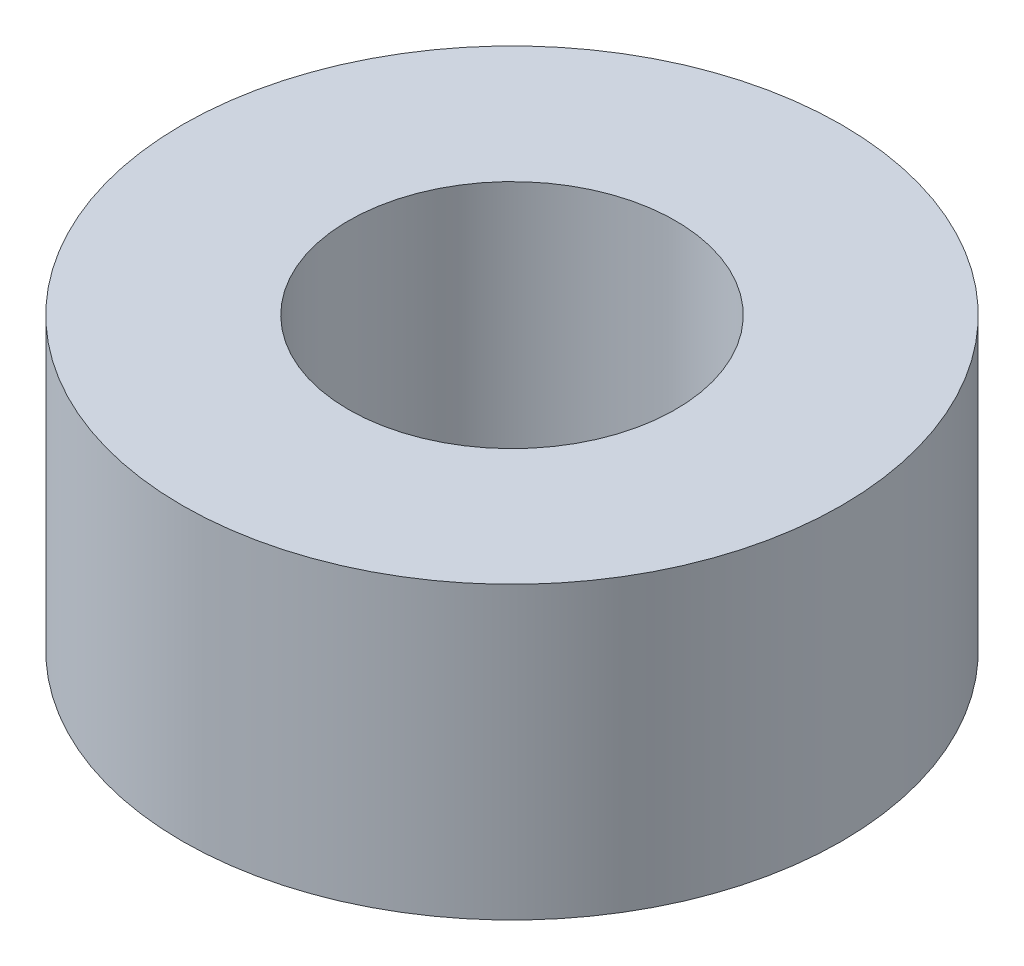
ISO-10303-21;
HEADER;
FILE_DESCRIPTION(('STEP AP214'),'2;1');
FILE_NAME('part.step','',(''),(''),'','','');
FILE_SCHEMA(('AUTOMOTIVE_DESIGN { 1 0 10303 214 1 1 1 1 }'));
ENDSEC;
DATA;
#1=APPLICATION_CONTEXT('core data for automotive mechanical design processes');
#2=APPLICATION_PROTOCOL_DEFINITION('international standard','automotive_design',2000,#1);
#3=PRODUCT_CONTEXT('',#1,'mechanical');
#4=PRODUCT('Part','Part','',(#3));
#5=PRODUCT_RELATED_PRODUCT_CATEGORY('part','',(#4));
#6=PRODUCT_DEFINITION_FORMATION('','',#4);
#7=PRODUCT_DEFINITION_CONTEXT('part definition',#1,'design');
#8=PRODUCT_DEFINITION('design','',#6,#7);
#9=PRODUCT_DEFINITION_SHAPE('','',#8);
#10=(LENGTH_UNIT() NAMED_UNIT(*) SI_UNIT(.MILLI.,.METRE.));
#11=(NAMED_UNIT(*) PLANE_ANGLE_UNIT() SI_UNIT($,.RADIAN.));
#12=(NAMED_UNIT(*) SI_UNIT($,.STERADIAN.) SOLID_ANGLE_UNIT());
#13=UNCERTAINTY_MEASURE_WITH_UNIT(LENGTH_MEASURE(1.E-05),#10,'distance_accuracy_value','');
#14=(GEOMETRIC_REPRESENTATION_CONTEXT(3) GLOBAL_UNCERTAINTY_ASSIGNED_CONTEXT((#13)) GLOBAL_UNIT_ASSIGNED_CONTEXT((#10,
#11,#12)) REPRESENTATION_CONTEXT('',''));
#15=CARTESIAN_POINT('',(0.,0.,0.));
#16=DIRECTION('',(0.,0.,1.));
#17=DIRECTION('',(1.,0.,0.));
#18=AXIS2_PLACEMENT_3D('',#15,#16,#17);
#19=CARTESIAN_POINT('',(0.,8.89,0.));
#20=DIRECTION('',(0.,1.,0.));
#21=DIRECTION('',(0.,0.,1.));
#22=AXIS2_PLACEMENT_3D('',#19,#20,#21);
#23=PLANE('',#22);
#24=CARTESIAN_POINT('',(0.,8.89,0.));
#25=DIRECTION('',(0.,1.,0.));
#26=DIRECTION('',(0.,0.,1.));
#27=AXIS2_PLACEMENT_3D('',#24,#25,#26);
#28=CIRCLE('',#27,10.08);
#29=CARTESIAN_POINT('',(0.,8.89,10.08));
#30=VERTEX_POINT('',#29);
#31=EDGE_CURVE('E10',#30,#30,#28,.T.);
#32=ORIENTED_EDGE('',*,*,#31,.T.);
#33=EDGE_LOOP('',(#32));
#34=FACE_BOUND('',#33,.T.);
#35=CARTESIAN_POINT('',(0.,8.89,0.));
#36=DIRECTION('',(0.,1.,0.));
#37=DIRECTION('',(0.,0.,1.));
#38=AXIS2_PLACEMENT_3D('',#35,#36,#37);
#39=CIRCLE('',#38,5.);
#40=CARTESIAN_POINT('',(0.,8.89,5.));
#41=VERTEX_POINT('',#40);
#42=EDGE_CURVE('E50',#41,#41,#39,.T.);
#43=ORIENTED_EDGE('',*,*,#42,.F.);
#44=EDGE_LOOP('',(#43));
#45=FACE_BOUND('',#44,.T.);
#46=ADVANCED_FACE('F37',(#34,#45),#23,.T.);
#47=CARTESIAN_POINT('',(0.,0.,0.));
#48=DIRECTION('',(0.,1.,0.));
#49=DIRECTION('',(0.,0.,1.));
#50=AXIS2_PLACEMENT_3D('',#47,#48,#49);
#51=PLANE('',#50);
#52=CARTESIAN_POINT('',(0.,0.,0.));
#53=DIRECTION('',(0.,1.,0.));
#54=DIRECTION('',(0.,0.,1.));
#55=AXIS2_PLACEMENT_3D('',#52,#53,#54);
#56=CIRCLE('',#55,10.08);
#57=CARTESIAN_POINT('',(0.,0.,10.08));
#58=VERTEX_POINT('',#57);
#59=EDGE_CURVE('E41',#58,#58,#56,.T.);
#60=ORIENTED_EDGE('',*,*,#59,.F.);
#61=EDGE_LOOP('',(#60));
#62=FACE_BOUND('',#61,.T.);
#63=CARTESIAN_POINT('',(0.,0.,0.));
#64=DIRECTION('',(0.,1.,0.));
#65=DIRECTION('',(0.,0.,1.));
#66=AXIS2_PLACEMENT_3D('',#63,#64,#65);
#67=CIRCLE('',#66,5.);
#68=CARTESIAN_POINT('',(0.,0.,5.));
#69=VERTEX_POINT('',#68);
#70=EDGE_CURVE('E52',#69,#69,#67,.T.);
#71=ORIENTED_EDGE('',*,*,#70,.T.);
#72=EDGE_LOOP('',(#71));
#73=FACE_BOUND('',#72,.T.);
#74=ADVANCED_FACE('F64',(#62,#73),#51,.F.);
#75=CARTESIAN_POINT('',(0.,8.89,0.));
#76=DIRECTION('',(0.,-1.,0.));
#77=DIRECTION('',(0.,0.,-1.));
#78=AXIS2_PLACEMENT_3D('',#75,#76,#77);
#79=CYLINDRICAL_SURFACE('',#78,10.08);
#80=ORIENTED_EDGE('',*,*,#31,.F.);
#81=EDGE_LOOP('',(#80));
#82=FACE_BOUND('',#81,.T.);
#83=ORIENTED_EDGE('',*,*,#59,.T.);
#84=EDGE_LOOP('',(#83));
#85=FACE_BOUND('',#84,.T.);
#86=ADVANCED_FACE('F39',(#82,#85),#79,.T.);
#87=CARTESIAN_POINT('',(0.,8.89,0.));
#88=DIRECTION('',(0.,-1.,0.));
#89=DIRECTION('',(0.,0.,-1.));
#90=AXIS2_PLACEMENT_3D('',#87,#88,#89);
#91=CYLINDRICAL_SURFACE('',#90,5.);
#92=ORIENTED_EDGE('',*,*,#42,.T.);
#93=EDGE_LOOP('',(#92));
#94=FACE_BOUND('',#93,.T.);
#95=ORIENTED_EDGE('',*,*,#70,.F.);
#96=EDGE_LOOP('',(#95));
#97=FACE_BOUND('',#96,.T.);
#98=ADVANCED_FACE('F60',(#94,#97),#91,.F.);
#99=CLOSED_SHELL('',(#46,#74,#86,#98));
#100=MANIFOLD_SOLID_BREP('B2',#99);
#101=ADVANCED_BREP_SHAPE_REPRESENTATION('',(#18,#100),#14);
#102=SHAPE_DEFINITION_REPRESENTATION(#9,#101);
ENDSEC;
END-ISO-10303-21;
